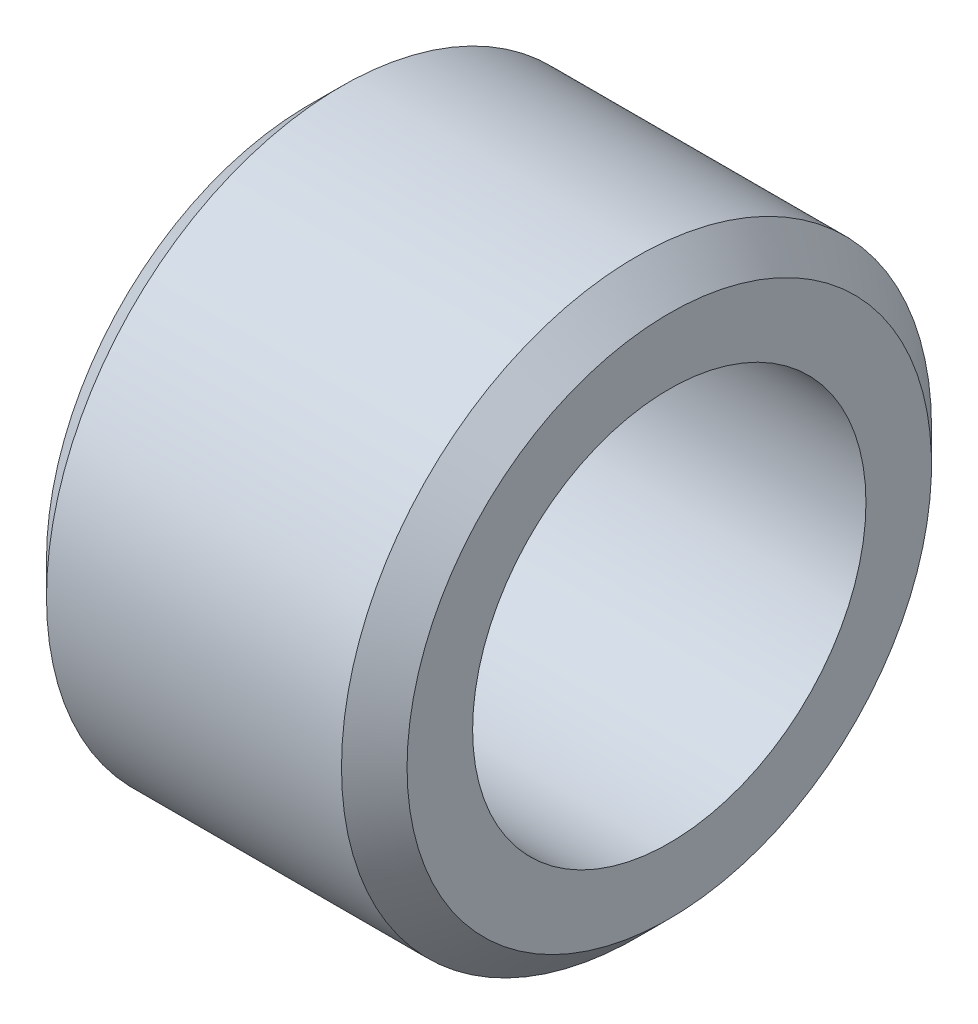
ISO-10303-21;
HEADER;
FILE_DESCRIPTION(('STEP AP214'),'2;1');
FILE_NAME('part.step','',(''),(''),'','','');
FILE_SCHEMA(('AUTOMOTIVE_DESIGN { 1 0 10303 214 1 1 1 1 }'));
ENDSEC;
DATA;
#1=APPLICATION_CONTEXT('core data for automotive mechanical design processes');
#2=APPLICATION_PROTOCOL_DEFINITION('international standard','automotive_design',2000,#1);
#3=PRODUCT_CONTEXT('',#1,'mechanical');
#4=PRODUCT('Part','Part','',(#3));
#5=PRODUCT_RELATED_PRODUCT_CATEGORY('part','',(#4));
#6=PRODUCT_DEFINITION_FORMATION('','',#4);
#7=PRODUCT_DEFINITION_CONTEXT('part definition',#1,'design');
#8=PRODUCT_DEFINITION('design','',#6,#7);
#9=PRODUCT_DEFINITION_SHAPE('','',#8);
#10=(LENGTH_UNIT() NAMED_UNIT(*) SI_UNIT(.MILLI.,.METRE.));
#11=(NAMED_UNIT(*) PLANE_ANGLE_UNIT() SI_UNIT($,.RADIAN.));
#12=(NAMED_UNIT(*) SI_UNIT($,.STERADIAN.) SOLID_ANGLE_UNIT());
#13=UNCERTAINTY_MEASURE_WITH_UNIT(LENGTH_MEASURE(1.E-05),#10,'distance_accuracy_value','');
#14=(GEOMETRIC_REPRESENTATION_CONTEXT(3) GLOBAL_UNCERTAINTY_ASSIGNED_CONTEXT((#13)) GLOBAL_UNIT_ASSIGNED_CONTEXT((#10,
#11,#12)) REPRESENTATION_CONTEXT('',''));
#15=CARTESIAN_POINT('',(0.,0.,0.));
#16=DIRECTION('',(0.,0.,1.));
#17=DIRECTION('',(1.,0.,0.));
#18=AXIS2_PLACEMENT_3D('',#15,#16,#17);
#19=CARTESIAN_POINT('',(0.5,0.,0.));
#20=DIRECTION('',(1.,0.,0.));
#21=DIRECTION('',(0.,0.,-1.));
#22=AXIS2_PLACEMENT_3D('',#19,#20,#21);
#23=CONICAL_SURFACE('',#22,4.5,0.785398163397448);
#24=CARTESIAN_POINT('',(0.,0.,0.));
#25=DIRECTION('',(-1.,0.,0.));
#26=DIRECTION('',(0.,0.,1.));
#27=AXIS2_PLACEMENT_3D('',#24,#25,#26);
#28=CIRCLE('',#27,4.);
#29=CARTESIAN_POINT('',(0.,0.,4.));
#30=VERTEX_POINT('',#29);
#31=EDGE_CURVE('E37',#30,#30,#28,.T.);
#32=ORIENTED_EDGE('',*,*,#31,.F.);
#33=EDGE_LOOP('',(#32));
#34=FACE_BOUND('',#33,.T.);
#35=CARTESIAN_POINT('',(0.5,0.,0.));
#36=DIRECTION('',(-1.,0.,0.));
#37=DIRECTION('',(0.,0.,1.));
#38=AXIS2_PLACEMENT_3D('',#35,#36,#37);
#39=CIRCLE('',#38,4.5);
#40=CARTESIAN_POINT('',(0.5,0.,4.5));
#41=VERTEX_POINT('',#40);
#42=EDGE_CURVE('E10',#41,#41,#39,.T.);
#43=ORIENTED_EDGE('',*,*,#42,.T.);
#44=EDGE_LOOP('',(#43));
#45=FACE_BOUND('',#44,.T.);
#46=ADVANCED_FACE('F15',(#34,#45),#23,.T.);
#47=CARTESIAN_POINT('',(5.5,0.,0.));
#48=DIRECTION('',(-1.,0.,0.));
#49=DIRECTION('',(0.,0.,1.));
#50=AXIS2_PLACEMENT_3D('',#47,#48,#49);
#51=CYLINDRICAL_SURFACE('',#50,4.5);
#52=ORIENTED_EDGE('',*,*,#42,.F.);
#53=EDGE_LOOP('',(#52));
#54=FACE_BOUND('',#53,.T.);
#55=CARTESIAN_POINT('',(5.,0.,0.));
#56=DIRECTION('',(-1.,0.,0.));
#57=DIRECTION('',(0.,0.,1.));
#58=AXIS2_PLACEMENT_3D('',#55,#56,#57);
#59=CIRCLE('',#58,4.5);
#60=CARTESIAN_POINT('',(5.,0.,4.5));
#61=VERTEX_POINT('',#60);
#62=EDGE_CURVE('E21',#61,#61,#59,.T.);
#63=ORIENTED_EDGE('',*,*,#62,.T.);
#64=EDGE_LOOP('',(#63));
#65=FACE_BOUND('',#64,.T.);
#66=ADVANCED_FACE('F44',(#54,#65),#51,.T.);
#67=CARTESIAN_POINT('',(5.5,0.,0.));
#68=DIRECTION('',(-1.,0.,0.));
#69=DIRECTION('',(0.,0.,1.));
#70=AXIS2_PLACEMENT_3D('',#67,#68,#69);
#71=CONICAL_SURFACE('',#70,4.,0.785398163397448);
#72=ORIENTED_EDGE('',*,*,#62,.F.);
#73=EDGE_LOOP('',(#72));
#74=FACE_BOUND('',#73,.T.);
#75=CARTESIAN_POINT('',(5.5,0.,0.));
#76=DIRECTION('',(-1.,0.,0.));
#77=DIRECTION('',(0.,0.,1.));
#78=AXIS2_PLACEMENT_3D('',#75,#76,#77);
#79=CIRCLE('',#78,4.);
#80=CARTESIAN_POINT('',(5.5,0.,4.));
#81=VERTEX_POINT('',#80);
#82=EDGE_CURVE('E25',#81,#81,#79,.T.);
#83=ORIENTED_EDGE('',*,*,#82,.T.);
#84=EDGE_LOOP('',(#83));
#85=FACE_BOUND('',#84,.T.);
#86=ADVANCED_FACE('F50',(#74,#85),#71,.T.);
#87=CARTESIAN_POINT('',(5.5,3.,0.));
#88=DIRECTION('',(-1.,0.,0.));
#89=DIRECTION('',(0.,0.,1.));
#90=AXIS2_PLACEMENT_3D('',#87,#88,#89);
#91=PLANE('',#90);
#92=ORIENTED_EDGE('',*,*,#82,.F.);
#93=EDGE_LOOP('',(#92));
#94=FACE_BOUND('',#93,.T.);
#95=CARTESIAN_POINT('',(5.5,0.,0.));
#96=DIRECTION('',(-1.,0.,0.));
#97=DIRECTION('',(0.,0.,1.));
#98=AXIS2_PLACEMENT_3D('',#95,#96,#97);
#99=CIRCLE('',#98,3.);
#100=CARTESIAN_POINT('',(5.5,0.,3.));
#101=VERTEX_POINT('',#100);
#102=EDGE_CURVE('E29',#101,#101,#99,.T.);
#103=ORIENTED_EDGE('',*,*,#102,.T.);
#104=EDGE_LOOP('',(#103));
#105=FACE_BOUND('',#104,.T.);
#106=ADVANCED_FACE('F56',(#94,#105),#91,.F.);
#107=CARTESIAN_POINT('',(5.5,0.,0.));
#108=DIRECTION('',(-1.,0.,0.));
#109=DIRECTION('',(0.,0.,1.));
#110=AXIS2_PLACEMENT_3D('',#107,#108,#109);
#111=CYLINDRICAL_SURFACE('',#110,3.);
#112=ORIENTED_EDGE('',*,*,#102,.F.);
#113=EDGE_LOOP('',(#112));
#114=FACE_BOUND('',#113,.T.);
#115=CARTESIAN_POINT('',(0.,0.,0.));
#116=DIRECTION('',(-1.,0.,0.));
#117=DIRECTION('',(0.,0.,1.));
#118=AXIS2_PLACEMENT_3D('',#115,#116,#117);
#119=CIRCLE('',#118,3.);
#120=CARTESIAN_POINT('',(0.,0.,3.));
#121=VERTEX_POINT('',#120);
#122=EDGE_CURVE('E34',#121,#121,#119,.T.);
#123=ORIENTED_EDGE('',*,*,#122,.T.);
#124=EDGE_LOOP('',(#123));
#125=FACE_BOUND('',#124,.T.);
#126=ADVANCED_FACE('F62',(#114,#125),#111,.F.);
#127=CARTESIAN_POINT('',(0.,4.,0.));
#128=DIRECTION('',(1.,0.,0.));
#129=DIRECTION('',(0.,0.,-1.));
#130=AXIS2_PLACEMENT_3D('',#127,#128,#129);
#131=PLANE('',#130);
#132=ORIENTED_EDGE('',*,*,#122,.F.);
#133=EDGE_LOOP('',(#132));
#134=FACE_BOUND('',#133,.T.);
#135=ORIENTED_EDGE('',*,*,#31,.T.);
#136=EDGE_LOOP('',(#135));
#137=FACE_BOUND('',#136,.T.);
#138=ADVANCED_FACE('F41',(#134,#137),#131,.F.);
#139=CLOSED_SHELL('',(#46,#66,#86,#106,#126,#138));
#140=MANIFOLD_SOLID_BREP('B1',#139);
#141=ADVANCED_BREP_SHAPE_REPRESENTATION('',(#18,#140),#14);
#142=SHAPE_DEFINITION_REPRESENTATION(#9,#141);
ENDSEC;
END-ISO-10303-21;
